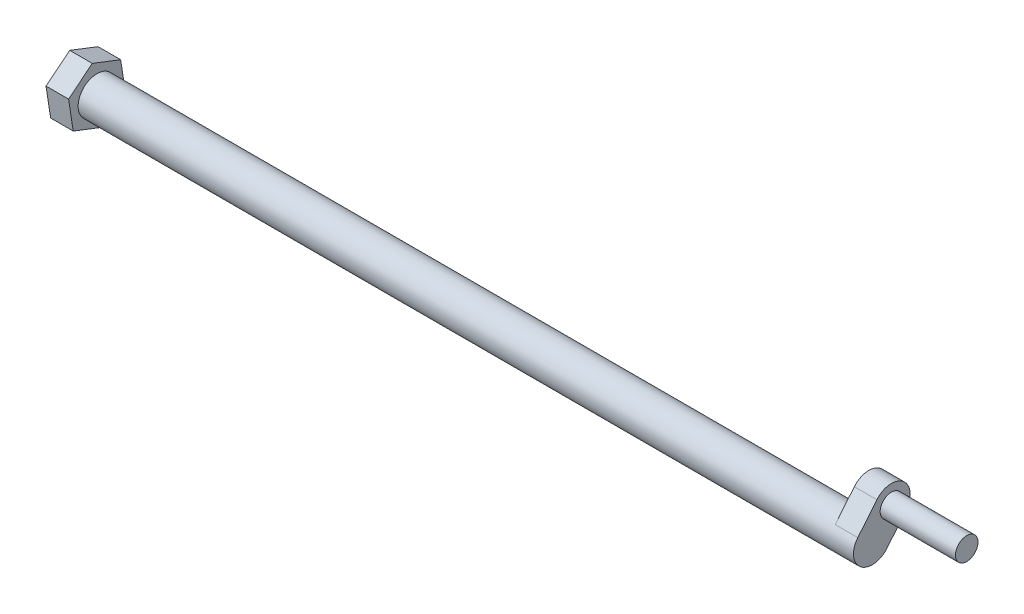
ISO-10303-21;
HEADER;
FILE_DESCRIPTION(('STEP AP214'),'2;1');
FILE_NAME('part.step','',(''),(''),'','','');
FILE_SCHEMA(('AUTOMOTIVE_DESIGN { 1 0 10303 214 1 1 1 1 }'));
ENDSEC;
DATA;
#1=APPLICATION_CONTEXT('core data for automotive mechanical design processes');
#2=APPLICATION_PROTOCOL_DEFINITION('international standard','automotive_design',2000,#1);
#3=PRODUCT_CONTEXT('',#1,'mechanical');
#4=PRODUCT('Part','Part','',(#3));
#5=PRODUCT_RELATED_PRODUCT_CATEGORY('part','',(#4));
#6=PRODUCT_DEFINITION_FORMATION('','',#4);
#7=PRODUCT_DEFINITION_CONTEXT('part definition',#1,'design');
#8=PRODUCT_DEFINITION('design','',#6,#7);
#9=PRODUCT_DEFINITION_SHAPE('','',#8);
#10=(LENGTH_UNIT() NAMED_UNIT(*) SI_UNIT(.MILLI.,.METRE.));
#11=(NAMED_UNIT(*) PLANE_ANGLE_UNIT() SI_UNIT($,.RADIAN.));
#12=(NAMED_UNIT(*) SI_UNIT($,.STERADIAN.) SOLID_ANGLE_UNIT());
#13=UNCERTAINTY_MEASURE_WITH_UNIT(LENGTH_MEASURE(1.E-05),#10,'distance_accuracy_value','');
#14=(GEOMETRIC_REPRESENTATION_CONTEXT(3) GLOBAL_UNCERTAINTY_ASSIGNED_CONTEXT((#13)) GLOBAL_UNIT_ASSIGNED_CONTEXT((#10,
#11,#12)) REPRESENTATION_CONTEXT('',''));
#15=CARTESIAN_POINT('',(0.,0.,0.));
#16=DIRECTION('',(0.,0.,1.));
#17=DIRECTION('',(1.,0.,0.));
#18=AXIS2_PLACEMENT_3D('',#15,#16,#17);
#19=CARTESIAN_POINT('',(100.,0.,0.));
#20=DIRECTION('',(-1.,0.,0.));
#21=DIRECTION('',(0.,0.,1.));
#22=AXIS2_PLACEMENT_3D('',#19,#20,#21);
#23=CYLINDRICAL_SURFACE('',#22,2.5);
#24=CARTESIAN_POINT('',(100.,0.,0.));
#25=DIRECTION('',(1.,0.,0.));
#26=DIRECTION('',(0.,0.,-1.));
#27=AXIS2_PLACEMENT_3D('',#24,#25,#26);
#28=CIRCLE('',#27,2.5);
#29=CARTESIAN_POINT('',(100.,-1.5879167976145,-1.93093765923546));
#30=VERTEX_POINT('',#29);
#31=CARTESIAN_POINT('',(100.,1.5879167976145,1.93093765923546));
#32=VERTEX_POINT('',#31);
#33=EDGE_CURVE('E11',#30,#32,#28,.T.);
#34=ORIENTED_EDGE('',*,*,#33,.F.);
#35=DIRECTION('',(-1.,0.,0.));
#36=VECTOR('',#35,1.);
#37=CARTESIAN_POINT('',(103.,-1.5879167976145,-1.93093765923546));
#38=LINE('',#37,#36);
#39=CARTESIAN_POINT('',(103.,-1.5879167976145,-1.93093765923546));
#40=VERTEX_POINT('',#39);
#41=EDGE_CURVE('E42',#40,#30,#38,.T.);
#42=ORIENTED_EDGE('',*,*,#41,.F.);
#43=CARTESIAN_POINT('',(103.,0.,0.));
#44=DIRECTION('',(1.,0.,0.));
#45=DIRECTION('',(0.,0.,-1.));
#46=AXIS2_PLACEMENT_3D('',#43,#44,#45);
#47=CIRCLE('',#46,2.5);
#48=CARTESIAN_POINT('',(103.,1.5879167976145,1.93093765923546));
#49=VERTEX_POINT('',#48);
#50=EDGE_CURVE('E184',#49,#40,#47,.T.);
#51=ORIENTED_EDGE('',*,*,#50,.F.);
#52=DIRECTION('',(-1.,0.,0.));
#53=VECTOR('',#52,1.);
#54=CARTESIAN_POINT('',(103.,1.5879167976145,1.93093765923546));
#55=LINE('',#54,#53);
#56=EDGE_CURVE('E191',#49,#32,#55,.T.);
#57=ORIENTED_EDGE('',*,*,#56,.T.);
#58=EDGE_LOOP('',(#34,#42,#51,#57));
#59=FACE_BOUND('',#58,.T.);
#60=CARTESIAN_POINT('',(0.,0.,0.));
#61=DIRECTION('',(1.,0.,0.));
#62=DIRECTION('',(0.,0.,-1.));
#63=AXIS2_PLACEMENT_3D('',#60,#61,#62);
#64=CIRCLE('',#63,2.5);
#65=CARTESIAN_POINT('',(0.,0.,-2.5));
#66=VERTEX_POINT('',#65);
#67=EDGE_CURVE('E37',#66,#66,#64,.T.);
#68=ORIENTED_EDGE('',*,*,#67,.T.);
#69=EDGE_LOOP('',(#68));
#70=FACE_BOUND('',#69,.T.);
#71=ADVANCED_FACE('F34',(#59,#70),#23,.T.);
#72=CARTESIAN_POINT('',(100.,0.,0.));
#73=DIRECTION('',(1.,0.,0.));
#74=DIRECTION('',(0.,0.,-1.));
#75=AXIS2_PLACEMENT_3D('',#72,#73,#74);
#76=PLANE('',#75);
#77=DIRECTION('',(0.,0.772375063694184,-0.635166719045799));
#78=VECTOR('',#77,1.);
#79=CARTESIAN_POINT('',(100.,-1.5879167976145,-1.93093765923546));
#80=LINE('',#79,#78);
#81=CARTESIAN_POINT('',(100.,1.50158345716224,-4.47160453541866));
#82=VERTEX_POINT('',#81);
#83=EDGE_CURVE('E180',#30,#82,#80,.T.);
#84=ORIENTED_EDGE('',*,*,#83,.F.);
#85=ORIENTED_EDGE('',*,*,#33,.T.);
#86=DIRECTION('',(0.,-0.772375063694184,0.635166719045799));
#87=VECTOR('',#86,1.);
#88=CARTESIAN_POINT('',(100.,1.5879167976145,1.93093765923546));
#89=LINE('',#88,#87);
#90=CARTESIAN_POINT('',(100.,4.67741705239123,-0.609729216947738));
#91=VERTEX_POINT('',#90);
#92=EDGE_CURVE('E186',#91,#32,#89,.T.);
#93=ORIENTED_EDGE('',*,*,#92,.F.);
#94=CARTESIAN_POINT('',(100.,3.08950025477674,-2.5406668761832));
#95=DIRECTION('',(1.,0.,0.));
#96=DIRECTION('',(0.,0.,-1.));
#97=AXIS2_PLACEMENT_3D('',#94,#95,#96);
#98=CIRCLE('',#97,2.5);
#99=EDGE_CURVE('E193',#82,#91,#98,.T.);
#100=ORIENTED_EDGE('',*,*,#99,.F.);
#101=EDGE_LOOP('',(#84,#85,#93,#100));
#102=FACE_BOUND('',#101,.T.);
#103=ADVANCED_FACE('F214',(#102),#76,.F.);
#104=CARTESIAN_POINT('',(103.,-1.5879167976145,-1.93093765923546));
#105=DIRECTION('',(0.,0.635166719045799,0.772375063694184));
#106=DIRECTION('',(0.,-0.772375063694184,0.635166719045799));
#107=AXIS2_PLACEMENT_3D('',#104,#105,#106);
#108=PLANE('',#107);
#109=ORIENTED_EDGE('',*,*,#83,.T.);
#110=DIRECTION('',(-1.,0.,0.));
#111=VECTOR('',#110,1.);
#112=CARTESIAN_POINT('',(103.,1.50158345716224,-4.47160453541866));
#113=LINE('',#112,#111);
#114=CARTESIAN_POINT('',(103.,1.50158345716224,-4.47160453541866));
#115=VERTEX_POINT('',#114);
#116=EDGE_CURVE('E200',#115,#82,#113,.T.);
#117=ORIENTED_EDGE('',*,*,#116,.F.);
#118=DIRECTION('',(0.,0.772375063694184,-0.635166719045799));
#119=VECTOR('',#118,1.);
#120=CARTESIAN_POINT('',(103.,-1.5879167976145,-1.93093765923546));
#121=LINE('',#120,#119);
#122=EDGE_CURVE('E79',#40,#115,#121,.T.);
#123=ORIENTED_EDGE('',*,*,#122,.F.);
#124=ORIENTED_EDGE('',*,*,#41,.T.);
#125=EDGE_LOOP('',(#109,#117,#123,#124));
#126=FACE_BOUND('',#125,.T.);
#127=ADVANCED_FACE('F203',(#126),#108,.F.);
#128=CARTESIAN_POINT('',(103.,3.08950025477674,-2.5406668761832));
#129=DIRECTION('',(-1.,0.,0.));
#130=DIRECTION('',(0.,0.,1.));
#131=AXIS2_PLACEMENT_3D('',#128,#129,#130);
#132=CYLINDRICAL_SURFACE('',#131,2.5);
#133=ORIENTED_EDGE('',*,*,#99,.T.);
#134=DIRECTION('',(-1.,0.,0.));
#135=VECTOR('',#134,1.);
#136=CARTESIAN_POINT('',(103.,4.67741705239123,-0.609729216947738));
#137=LINE('',#136,#135);
#138=CARTESIAN_POINT('',(103.,4.67741705239123,-0.609729216947738));
#139=VERTEX_POINT('',#138);
#140=EDGE_CURVE('E197',#139,#91,#137,.T.);
#141=ORIENTED_EDGE('',*,*,#140,.F.);
#142=CARTESIAN_POINT('',(103.,3.08950025477674,-2.5406668761832));
#143=DIRECTION('',(1.,0.,0.));
#144=DIRECTION('',(0.,0.,-1.));
#145=AXIS2_PLACEMENT_3D('',#142,#143,#144);
#146=CIRCLE('',#145,2.5);
#147=EDGE_CURVE('E188',#115,#139,#146,.T.);
#148=ORIENTED_EDGE('',*,*,#147,.F.);
#149=ORIENTED_EDGE('',*,*,#116,.T.);
#150=EDGE_LOOP('',(#133,#141,#148,#149));
#151=FACE_BOUND('',#150,.T.);
#152=ADVANCED_FACE('F211',(#151),#132,.T.);
#153=CARTESIAN_POINT('',(103.,1.5879167976145,1.93093765923546));
#154=DIRECTION('',(0.,-0.635166719045799,-0.772375063694184));
#155=DIRECTION('',(0.,0.772375063694184,-0.6351667190458));
#156=AXIS2_PLACEMENT_3D('',#153,#154,#155);
#157=PLANE('',#156);
#158=ORIENTED_EDGE('',*,*,#92,.T.);
#159=ORIENTED_EDGE('',*,*,#56,.F.);
#160=DIRECTION('',(0.,-0.772375063694184,0.635166719045799));
#161=VECTOR('',#160,1.);
#162=CARTESIAN_POINT('',(103.,1.5879167976145,1.93093765923546));
#163=LINE('',#162,#161);
#164=EDGE_CURVE('E56',#139,#49,#163,.T.);
#165=ORIENTED_EDGE('',*,*,#164,.F.);
#166=ORIENTED_EDGE('',*,*,#140,.T.);
#167=EDGE_LOOP('',(#158,#159,#165,#166));
#168=FACE_BOUND('',#167,.T.);
#169=ADVANCED_FACE('F213',(#168),#157,.F.);
#170=CARTESIAN_POINT('',(103.,0.,0.));
#171=DIRECTION('',(1.,0.,0.));
#172=DIRECTION('',(0.,0.,-1.));
#173=AXIS2_PLACEMENT_3D('',#170,#171,#172);
#174=PLANE('',#173);
#175=CARTESIAN_POINT('',(103.,3.08950025477674,-2.5406668761832));
#176=DIRECTION('',(1.,0.,0.));
#177=DIRECTION('',(0.,0.,-1.));
#178=AXIS2_PLACEMENT_3D('',#175,#176,#177);
#179=CIRCLE('',#178,1.5);
#180=CARTESIAN_POINT('',(103.,3.08950025477674,-4.0406668761832));
#181=VERTEX_POINT('',#180);
#182=EDGE_CURVE('E181',#181,#181,#179,.T.);
#183=ORIENTED_EDGE('',*,*,#182,.F.);
#184=EDGE_LOOP('',(#183));
#185=FACE_BOUND('',#184,.T.);
#186=ORIENTED_EDGE('',*,*,#50,.T.);
#187=ORIENTED_EDGE('',*,*,#122,.T.);
#188=ORIENTED_EDGE('',*,*,#147,.T.);
#189=ORIENTED_EDGE('',*,*,#164,.T.);
#190=EDGE_LOOP('',(#186,#187,#188,#189));
#191=FACE_BOUND('',#190,.T.);
#192=ADVANCED_FACE('F206',(#185,#191),#174,.T.);
#193=CARTESIAN_POINT('',(113.,3.08950025477674,-2.5406668761832));
#194=DIRECTION('',(-1.,0.,0.));
#195=DIRECTION('',(0.,0.,1.));
#196=AXIS2_PLACEMENT_3D('',#193,#194,#195);
#197=CYLINDRICAL_SURFACE('',#196,1.5);
#198=CARTESIAN_POINT('',(113.,3.08950025477674,-2.5406668761832));
#199=DIRECTION('',(1.,0.,0.));
#200=DIRECTION('',(0.,0.,-1.));
#201=AXIS2_PLACEMENT_3D('',#198,#199,#200);
#202=CIRCLE('',#201,1.5);
#203=CARTESIAN_POINT('',(113.,3.08950025477674,-4.0406668761832));
#204=VERTEX_POINT('',#203);
#205=EDGE_CURVE('E177',#204,#204,#202,.T.);
#206=ORIENTED_EDGE('',*,*,#205,.F.);
#207=EDGE_LOOP('',(#206));
#208=FACE_BOUND('',#207,.T.);
#209=ORIENTED_EDGE('',*,*,#182,.T.);
#210=EDGE_LOOP('',(#209));
#211=FACE_BOUND('',#210,.T.);
#212=ADVANCED_FACE('F241',(#208,#211),#197,.T.);
#213=CARTESIAN_POINT('',(113.,3.08950025477674,-2.5406668761832));
#214=DIRECTION('',(1.,0.,0.));
#215=DIRECTION('',(0.,0.,-1.));
#216=AXIS2_PLACEMENT_3D('',#213,#214,#215);
#217=PLANE('',#216);
#218=ORIENTED_EDGE('',*,*,#205,.T.);
#219=EDGE_LOOP('',(#218));
#220=FACE_BOUND('',#219,.T.);
#221=ADVANCED_FACE('F248',(#220),#217,.T.);
#222=CARTESIAN_POINT('',(-3.,1.46055157695232,3.76830498027899));
#223=DIRECTION('',(0.,-0.153231496671505,0.988190319942373));
#224=DIRECTION('',(0.,-0.988190319942373,-0.153231496671505));
#225=AXIS2_PLACEMENT_3D('',#222,#223,#224);
#226=PLANE('',#225);
#227=DIRECTION('',(0.,-0.988190319942373,-0.153231496671505));
#228=VECTOR('',#227,1.);
#229=CARTESIAN_POINT('',(0.,1.46055157695232,3.76830498027899));
#230=LINE('',#229,#228);
#231=CARTESIAN_POINT('',(0.,1.46055157695232,3.76830498027899));
#232=VERTEX_POINT('',#231);
#233=CARTESIAN_POINT('',(0.,-2.53317205365286,3.14902725931763));
#234=VERTEX_POINT('',#233);
#235=EDGE_CURVE('E158',#232,#234,#230,.T.);
#236=ORIENTED_EDGE('',*,*,#235,.F.);
#237=DIRECTION('',(1.,0.,0.));
#238=VECTOR('',#237,1.);
#239=CARTESIAN_POINT('',(-3.,1.46055157695232,3.76830498027899));
#240=LINE('',#239,#238);
#241=CARTESIAN_POINT('',(-3.,1.46055157695232,3.76830498027899));
#242=VERTEX_POINT('',#241);
#243=EDGE_CURVE('E143',#242,#232,#240,.T.);
#244=ORIENTED_EDGE('',*,*,#243,.F.);
#245=DIRECTION('',(0.,-0.988190319942373,-0.153231496671505));
#246=VECTOR('',#245,1.);
#247=CARTESIAN_POINT('',(-3.,1.46055157695232,3.76830498027899));
#248=LINE('',#247,#246);
#249=CARTESIAN_POINT('',(-3.,-2.53317205365286,3.14902725931763));
#250=VERTEX_POINT('',#249);
#251=EDGE_CURVE('E136',#242,#250,#248,.T.);
#252=ORIENTED_EDGE('',*,*,#251,.T.);
#253=DIRECTION('',(1.,0.,0.));
#254=VECTOR('',#253,1.);
#255=CARTESIAN_POINT('',(-3.,-2.53317205365286,3.14902725931763));
#256=LINE('',#255,#254);
#257=EDGE_CURVE('E118',#250,#234,#256,.T.);
#258=ORIENTED_EDGE('',*,*,#257,.T.);
#259=EDGE_LOOP('',(#236,#244,#252,#258));
#260=FACE_BOUND('',#259,.T.);
#261=ADVANCED_FACE('F142',(#260),#226,.T.);
#262=CARTESIAN_POINT('',(-3.,3.99372363060518,0.61927772096136));
#263=DIRECTION('',(0.,0.779182172508215,0.626797528748621));
#264=DIRECTION('',(0.,-0.626797528748621,0.779182172508215));
#265=AXIS2_PLACEMENT_3D('',#262,#263,#264);
#266=PLANE('',#265);
#267=DIRECTION('',(0.,-0.626797528748621,0.779182172508215));
#268=VECTOR('',#267,1.);
#269=CARTESIAN_POINT('',(0.,3.99372363060518,0.61927772096136));
#270=LINE('',#269,#268);
#271=CARTESIAN_POINT('',(0.,3.99372363060518,0.61927772096136));
#272=VERTEX_POINT('',#271);
#273=EDGE_CURVE('E144',#272,#232,#270,.T.);
#274=ORIENTED_EDGE('',*,*,#273,.F.);
#275=DIRECTION('',(1.,0.,0.));
#276=VECTOR('',#275,1.);
#277=CARTESIAN_POINT('',(-3.,3.99372363060518,0.61927772096136));
#278=LINE('',#277,#276);
#279=CARTESIAN_POINT('',(-3.,3.99372363060518,0.61927772096136));
#280=VERTEX_POINT('',#279);
#281=EDGE_CURVE('E170',#280,#272,#278,.T.);
#282=ORIENTED_EDGE('',*,*,#281,.F.);
#283=DIRECTION('',(0.,-0.626797528748621,0.779182172508215));
#284=VECTOR('',#283,1.);
#285=CARTESIAN_POINT('',(-3.,3.99372363060518,0.61927772096136));
#286=LINE('',#285,#284);
#287=EDGE_CURVE('E129',#280,#242,#286,.T.);
#288=ORIENTED_EDGE('',*,*,#287,.T.);
#289=ORIENTED_EDGE('',*,*,#243,.T.);
#290=EDGE_LOOP('',(#274,#282,#288,#289));
#291=FACE_BOUND('',#290,.T.);
#292=ADVANCED_FACE('F262',(#291),#266,.T.);
#293=CARTESIAN_POINT('',(-3.,2.53317205365286,-3.14902725931762));
#294=DIRECTION('',(0.,0.93241366917972,-0.361392791193752));
#295=DIRECTION('',(0.,0.361392791193752,0.93241366917972));
#296=AXIS2_PLACEMENT_3D('',#293,#294,#295);
#297=PLANE('',#296);
#298=DIRECTION('',(0.,0.361392791193752,0.93241366917972));
#299=VECTOR('',#298,1.);
#300=CARTESIAN_POINT('',(0.,2.53317205365286,-3.14902725931762));
#301=LINE('',#300,#299);
#302=CARTESIAN_POINT('',(0.,2.53317205365286,-3.14902725931762));
#303=VERTEX_POINT('',#302);
#304=EDGE_CURVE('E147',#303,#272,#301,.T.);
#305=ORIENTED_EDGE('',*,*,#304,.F.);
#306=DIRECTION('',(1.,0.,0.));
#307=VECTOR('',#306,1.);
#308=CARTESIAN_POINT('',(-3.,2.53317205365286,-3.14902725931762));
#309=LINE('',#308,#307);
#310=CARTESIAN_POINT('',(-3.,2.53317205365286,-3.14902725931762));
#311=VERTEX_POINT('',#310);
#312=EDGE_CURVE('E172',#311,#303,#309,.T.);
#313=ORIENTED_EDGE('',*,*,#312,.F.);
#314=DIRECTION('',(0.,0.361392791193752,0.93241366917972));
#315=VECTOR('',#314,1.);
#316=CARTESIAN_POINT('',(-3.,2.53317205365286,-3.14902725931762));
#317=LINE('',#316,#315);
#318=EDGE_CURVE('E154',#311,#280,#317,.T.);
#319=ORIENTED_EDGE('',*,*,#318,.T.);
#320=ORIENTED_EDGE('',*,*,#281,.T.);
#321=EDGE_LOOP('',(#305,#313,#319,#320));
#322=FACE_BOUND('',#321,.T.);
#323=ADVANCED_FACE('F269',(#322),#297,.T.);
#324=CARTESIAN_POINT('',(-3.,-1.46055157695232,-3.76830498027899));
#325=DIRECTION('',(0.,0.153231496671506,-0.988190319942373));
#326=DIRECTION('',(0.,0.988190319942373,0.153231496671506));
#327=AXIS2_PLACEMENT_3D('',#324,#325,#326);
#328=PLANE('',#327);
#329=DIRECTION('',(0.,0.988190319942373,0.153231496671506));
#330=VECTOR('',#329,1.);
#331=CARTESIAN_POINT('',(0.,-1.46055157695232,-3.76830498027899));
#332=LINE('',#331,#330);
#333=CARTESIAN_POINT('',(0.,-1.46055157695232,-3.76830498027899));
#334=VERTEX_POINT('',#333);
#335=EDGE_CURVE('E164',#334,#303,#332,.T.);
#336=ORIENTED_EDGE('',*,*,#335,.F.);
#337=DIRECTION('',(1.,0.,0.));
#338=VECTOR('',#337,1.);
#339=CARTESIAN_POINT('',(-3.,-1.46055157695232,-3.76830498027899));
#340=LINE('',#339,#338);
#341=CARTESIAN_POINT('',(-3.,-1.46055157695232,-3.76830498027899));
#342=VERTEX_POINT('',#341);
#343=EDGE_CURVE('E174',#342,#334,#340,.T.);
#344=ORIENTED_EDGE('',*,*,#343,.F.);
#345=DIRECTION('',(0.,0.988190319942373,0.153231496671506));
#346=VECTOR('',#345,1.);
#347=CARTESIAN_POINT('',(-3.,-1.46055157695232,-3.76830498027899));
#348=LINE('',#347,#346);
#349=EDGE_CURVE('E151',#342,#311,#348,.T.);
#350=ORIENTED_EDGE('',*,*,#349,.T.);
#351=ORIENTED_EDGE('',*,*,#312,.T.);
#352=EDGE_LOOP('',(#336,#344,#350,#351));
#353=FACE_BOUND('',#352,.T.);
#354=ADVANCED_FACE('F277',(#353),#328,.T.);
#355=CARTESIAN_POINT('',(-3.,-3.99372363060518,-0.61927772096136));
#356=DIRECTION('',(0.,-0.779182172508215,-0.626797528748621));
#357=DIRECTION('',(0.,0.626797528748621,-0.779182172508215));
#358=AXIS2_PLACEMENT_3D('',#355,#356,#357);
#359=PLANE('',#358);
#360=DIRECTION('',(0.,0.626797528748621,-0.779182172508215));
#361=VECTOR('',#360,1.);
#362=CARTESIAN_POINT('',(0.,-3.99372363060518,-0.61927772096136));
#363=LINE('',#362,#361);
#364=CARTESIAN_POINT('',(0.,-3.99372363060518,-0.61927772096136));
#365=VERTEX_POINT('',#364);
#366=EDGE_CURVE('E161',#365,#334,#363,.T.);
#367=ORIENTED_EDGE('',*,*,#366,.F.);
#368=DIRECTION('',(1.,0.,0.));
#369=VECTOR('',#368,1.);
#370=CARTESIAN_POINT('',(-3.,-3.99372363060518,-0.61927772096136));
#371=LINE('',#370,#369);
#372=CARTESIAN_POINT('',(-3.,-3.99372363060518,-0.61927772096136));
#373=VERTEX_POINT('',#372);
#374=EDGE_CURVE('E128',#373,#365,#371,.T.);
#375=ORIENTED_EDGE('',*,*,#374,.F.);
#376=DIRECTION('',(0.,0.626797528748621,-0.779182172508215));
#377=VECTOR('',#376,1.);
#378=CARTESIAN_POINT('',(-3.,-3.99372363060518,-0.61927772096136));
#379=LINE('',#378,#377);
#380=EDGE_CURVE('E140',#373,#342,#379,.T.);
#381=ORIENTED_EDGE('',*,*,#380,.T.);
#382=ORIENTED_EDGE('',*,*,#343,.T.);
#383=EDGE_LOOP('',(#367,#375,#381,#382));
#384=FACE_BOUND('',#383,.T.);
#385=ADVANCED_FACE('F285',(#384),#359,.T.);
#386=CARTESIAN_POINT('',(-3.,-2.53317205365286,3.14902725931763));
#387=DIRECTION('',(0.,-0.93241366917972,0.361392791193752));
#388=DIRECTION('',(0.,-0.361392791193752,-0.93241366917972));
#389=AXIS2_PLACEMENT_3D('',#386,#387,#388);
#390=PLANE('',#389);
#391=DIRECTION('',(0.,-0.361392791193752,-0.93241366917972));
#392=VECTOR('',#391,1.);
#393=CARTESIAN_POINT('',(0.,-2.53317205365286,3.14902725931763));
#394=LINE('',#393,#392);
#395=EDGE_CURVE('E123',#234,#365,#394,.T.);
#396=ORIENTED_EDGE('',*,*,#395,.F.);
#397=ORIENTED_EDGE('',*,*,#257,.F.);
#398=DIRECTION('',(0.,-0.361392791193752,-0.93241366917972));
#399=VECTOR('',#398,1.);
#400=CARTESIAN_POINT('',(-3.,-2.53317205365286,3.14902725931763));
#401=LINE('',#400,#399);
#402=EDGE_CURVE('E121',#250,#373,#401,.T.);
#403=ORIENTED_EDGE('',*,*,#402,.T.);
#404=ORIENTED_EDGE('',*,*,#374,.T.);
#405=EDGE_LOOP('',(#396,#397,#403,#404));
#406=FACE_BOUND('',#405,.T.);
#407=ADVANCED_FACE('F120',(#406),#390,.T.);
#408=CARTESIAN_POINT('',(-3.,0.,0.));
#409=DIRECTION('',(1.,0.,0.));
#410=DIRECTION('',(0.,0.,-1.));
#411=AXIS2_PLACEMENT_3D('',#408,#409,#410);
#412=PLANE('',#411);
#413=ORIENTED_EDGE('',*,*,#251,.F.);
#414=ORIENTED_EDGE('',*,*,#287,.F.);
#415=ORIENTED_EDGE('',*,*,#318,.F.);
#416=ORIENTED_EDGE('',*,*,#349,.F.);
#417=ORIENTED_EDGE('',*,*,#380,.F.);
#418=ORIENTED_EDGE('',*,*,#402,.F.);
#419=EDGE_LOOP('',(#413,#414,#415,#416,#417,#418));
#420=FACE_BOUND('',#419,.T.);
#421=ADVANCED_FACE('F134',(#420),#412,.F.);
#422=CARTESIAN_POINT('',(0.,0.,0.));
#423=DIRECTION('',(1.,0.,0.));
#424=DIRECTION('',(0.,0.,-1.));
#425=AXIS2_PLACEMENT_3D('',#422,#423,#424);
#426=PLANE('',#425);
#427=ORIENTED_EDGE('',*,*,#67,.F.);
#428=EDGE_LOOP('',(#427));
#429=FACE_BOUND('',#428,.T.);
#430=ORIENTED_EDGE('',*,*,#235,.T.);
#431=ORIENTED_EDGE('',*,*,#395,.T.);
#432=ORIENTED_EDGE('',*,*,#366,.T.);
#433=ORIENTED_EDGE('',*,*,#335,.T.);
#434=ORIENTED_EDGE('',*,*,#304,.T.);
#435=ORIENTED_EDGE('',*,*,#273,.T.);
#436=EDGE_LOOP('',(#430,#431,#432,#433,#434,#435));
#437=FACE_BOUND('',#436,.T.);
#438=ADVANCED_FACE('F306',(#429,#437),#426,.T.);
#439=CLOSED_SHELL('',(#71,#103,#127,#152,#169,#192,#212,#221,#261,#292,#323,#354,#385,#407,#421,#438));
#440=MANIFOLD_SOLID_BREP('B2',#439);
#441=ADVANCED_BREP_SHAPE_REPRESENTATION('',(#18,#440),#14);
#442=SHAPE_DEFINITION_REPRESENTATION(#9,#441);
ENDSEC;
END-ISO-10303-21;
